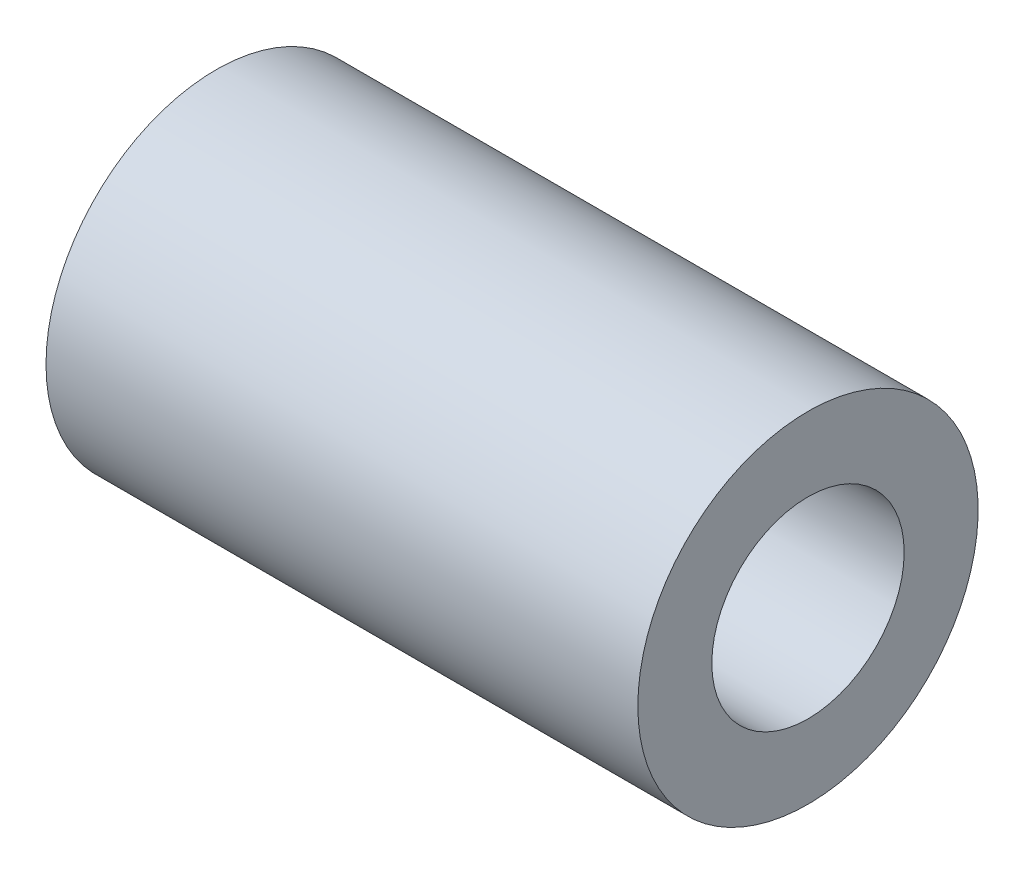
ISO-10303-21;
HEADER;
FILE_DESCRIPTION(('STEP AP214'),'2;1');
FILE_NAME('part.step','',(''),(''),'','','');
FILE_SCHEMA(('AUTOMOTIVE_DESIGN { 1 0 10303 214 1 1 1 1 }'));
ENDSEC;
DATA;
#1=APPLICATION_CONTEXT('core data for automotive mechanical design processes');
#2=APPLICATION_PROTOCOL_DEFINITION('international standard','automotive_design',2000,#1);
#3=PRODUCT_CONTEXT('',#1,'mechanical');
#4=PRODUCT('Part','Part','',(#3));
#5=PRODUCT_RELATED_PRODUCT_CATEGORY('part','',(#4));
#6=PRODUCT_DEFINITION_FORMATION('','',#4);
#7=PRODUCT_DEFINITION_CONTEXT('part definition',#1,'design');
#8=PRODUCT_DEFINITION('design','',#6,#7);
#9=PRODUCT_DEFINITION_SHAPE('','',#8);
#10=(LENGTH_UNIT() NAMED_UNIT(*) SI_UNIT(.MILLI.,.METRE.));
#11=(NAMED_UNIT(*) PLANE_ANGLE_UNIT() SI_UNIT($,.RADIAN.));
#12=(NAMED_UNIT(*) SI_UNIT($,.STERADIAN.) SOLID_ANGLE_UNIT());
#13=UNCERTAINTY_MEASURE_WITH_UNIT(LENGTH_MEASURE(1.E-05),#10,'distance_accuracy_value','');
#14=(GEOMETRIC_REPRESENTATION_CONTEXT(3) GLOBAL_UNCERTAINTY_ASSIGNED_CONTEXT((#13)) GLOBAL_UNIT_ASSIGNED_CONTEXT((#10,
#11,#12)) REPRESENTATION_CONTEXT('',''));
#15=CARTESIAN_POINT('',(0.,0.,0.));
#16=DIRECTION('',(0.,0.,1.));
#17=DIRECTION('',(1.,0.,0.));
#18=AXIS2_PLACEMENT_3D('',#15,#16,#17);
#19=CARTESIAN_POINT('',(0.,6.9,0.));
#20=DIRECTION('',(1.,0.,0.));
#21=DIRECTION('',(0.,0.,-1.));
#22=AXIS2_PLACEMENT_3D('',#19,#20,#21);
#23=PLANE('',#22);
#24=CARTESIAN_POINT('',(0.,0.,0.));
#25=DIRECTION('',(-1.,0.,0.));
#26=DIRECTION('',(0.,0.,1.));
#27=AXIS2_PLACEMENT_3D('',#24,#25,#26);
#28=CIRCLE('',#27,3.89999999999999);
#29=CARTESIAN_POINT('',(0.,0.,3.89999999999999));
#30=VERTEX_POINT('',#29);
#31=EDGE_CURVE('E44',#30,#30,#28,.T.);
#32=ORIENTED_EDGE('',*,*,#31,.F.);
#33=EDGE_LOOP('',(#32));
#34=FACE_BOUND('',#33,.T.);
#35=CARTESIAN_POINT('',(0.,0.,0.));
#36=DIRECTION('',(-1.,0.,0.));
#37=DIRECTION('',(0.,0.,1.));
#38=AXIS2_PLACEMENT_3D('',#35,#36,#37);
#39=CIRCLE('',#38,6.9);
#40=CARTESIAN_POINT('',(0.,0.,6.9));
#41=VERTEX_POINT('',#40);
#42=EDGE_CURVE('E36',#41,#41,#39,.T.);
#43=ORIENTED_EDGE('',*,*,#42,.T.);
#44=EDGE_LOOP('',(#43));
#45=FACE_BOUND('',#44,.T.);
#46=ADVANCED_FACE('F30',(#34,#45),#23,.F.);
#47=CARTESIAN_POINT('',(24.,6.9,0.));
#48=DIRECTION('',(-1.,0.,0.));
#49=DIRECTION('',(0.,0.,1.));
#50=AXIS2_PLACEMENT_3D('',#47,#48,#49);
#51=PLANE('',#50);
#52=CARTESIAN_POINT('',(24.,0.,0.));
#53=DIRECTION('',(-1.,0.,0.));
#54=DIRECTION('',(0.,0.,1.));
#55=AXIS2_PLACEMENT_3D('',#52,#53,#54);
#56=CIRCLE('',#55,3.89999999999999);
#57=CARTESIAN_POINT('',(24.,0.,3.89999999999999));
#58=VERTEX_POINT('',#57);
#59=EDGE_CURVE('E40',#58,#58,#56,.T.);
#60=ORIENTED_EDGE('',*,*,#59,.T.);
#61=EDGE_LOOP('',(#60));
#62=FACE_BOUND('',#61,.T.);
#63=CARTESIAN_POINT('',(24.,0.,0.));
#64=DIRECTION('',(-1.,0.,0.));
#65=DIRECTION('',(0.,0.,1.));
#66=AXIS2_PLACEMENT_3D('',#63,#64,#65);
#67=CIRCLE('',#66,6.9);
#68=CARTESIAN_POINT('',(24.,0.,6.9));
#69=VERTEX_POINT('',#68);
#70=EDGE_CURVE('E10',#69,#69,#67,.T.);
#71=ORIENTED_EDGE('',*,*,#70,.F.);
#72=EDGE_LOOP('',(#71));
#73=FACE_BOUND('',#72,.T.);
#74=ADVANCED_FACE('F53',(#62,#73),#51,.F.);
#75=CARTESIAN_POINT('',(-12.2300308177568,0.,0.));
#76=DIRECTION('',(-1.,0.,0.));
#77=DIRECTION('',(0.,0.,1.));
#78=AXIS2_PLACEMENT_3D('',#75,#76,#77);
#79=CYLINDRICAL_SURFACE('',#78,6.9);
#80=ORIENTED_EDGE('',*,*,#42,.F.);
#81=EDGE_LOOP('',(#80));
#82=FACE_BOUND('',#81,.T.);
#83=ORIENTED_EDGE('',*,*,#70,.T.);
#84=EDGE_LOOP('',(#83));
#85=FACE_BOUND('',#84,.T.);
#86=ADVANCED_FACE('F57',(#82,#85),#79,.T.);
#87=CARTESIAN_POINT('',(0.,0.,0.));
#88=DIRECTION('',(-1.,0.,0.));
#89=DIRECTION('',(0.,0.,1.));
#90=AXIS2_PLACEMENT_3D('',#87,#88,#89);
#91=CYLINDRICAL_SURFACE('',#90,3.89999999999999);
#92=ORIENTED_EDGE('',*,*,#59,.F.);
#93=EDGE_LOOP('',(#92));
#94=FACE_BOUND('',#93,.T.);
#95=ORIENTED_EDGE('',*,*,#31,.T.);
#96=EDGE_LOOP('',(#95));
#97=FACE_BOUND('',#96,.T.);
#98=ADVANCED_FACE('F50',(#94,#97),#91,.F.);
#99=CLOSED_SHELL('',(#46,#74,#86,#98));
#100=MANIFOLD_SOLID_BREP('B2',#99);
#101=ADVANCED_BREP_SHAPE_REPRESENTATION('',(#18,#100),#14);
#102=SHAPE_DEFINITION_REPRESENTATION(#9,#101);
ENDSEC;
END-ISO-10303-21;
